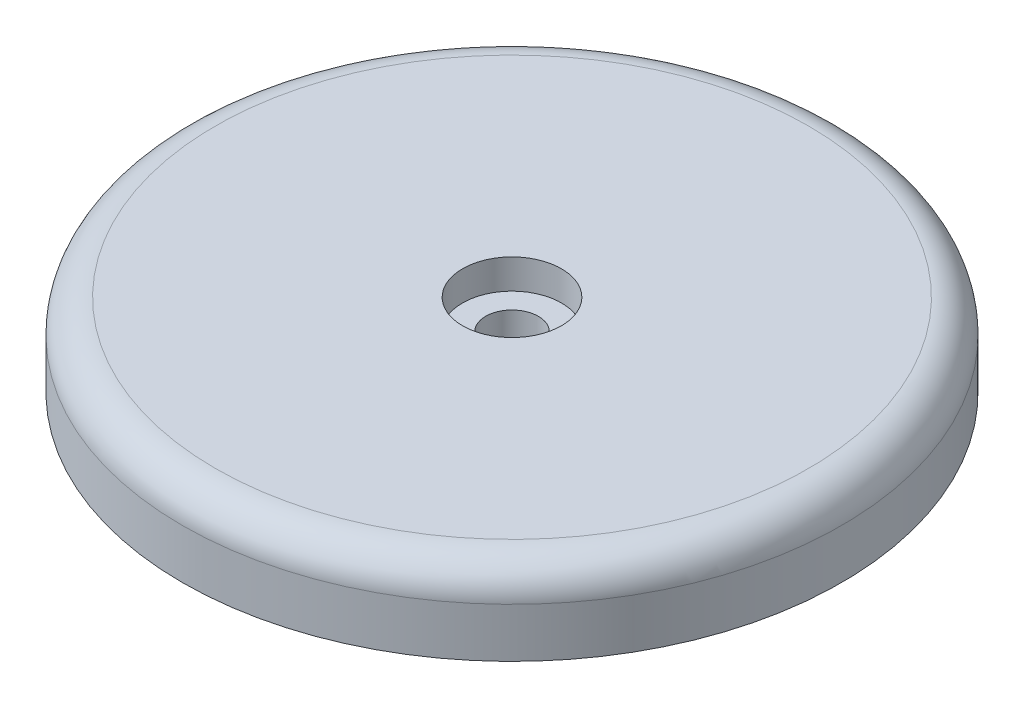
ISO-10303-21;
HEADER;
FILE_DESCRIPTION(('STEP AP214'),'2;1');
FILE_NAME('part.step','',(''),(''),'','','');
FILE_SCHEMA(('AUTOMOTIVE_DESIGN { 1 0 10303 214 1 1 1 1 }'));
ENDSEC;
DATA;
#1=APPLICATION_CONTEXT('core data for automotive mechanical design processes');
#2=APPLICATION_PROTOCOL_DEFINITION('international standard','automotive_design',2000,#1);
#3=PRODUCT_CONTEXT('',#1,'mechanical');
#4=PRODUCT('Part','Part','',(#3));
#5=PRODUCT_RELATED_PRODUCT_CATEGORY('part','',(#4));
#6=PRODUCT_DEFINITION_FORMATION('','',#4);
#7=PRODUCT_DEFINITION_CONTEXT('part definition',#1,'design');
#8=PRODUCT_DEFINITION('design','',#6,#7);
#9=PRODUCT_DEFINITION_SHAPE('','',#8);
#10=(LENGTH_UNIT() NAMED_UNIT(*) SI_UNIT(.MILLI.,.METRE.));
#11=(NAMED_UNIT(*) PLANE_ANGLE_UNIT() SI_UNIT($,.RADIAN.));
#12=(NAMED_UNIT(*) SI_UNIT($,.STERADIAN.) SOLID_ANGLE_UNIT());
#13=UNCERTAINTY_MEASURE_WITH_UNIT(LENGTH_MEASURE(1.E-05),#10,'distance_accuracy_value','');
#14=(GEOMETRIC_REPRESENTATION_CONTEXT(3) GLOBAL_UNCERTAINTY_ASSIGNED_CONTEXT((#13)) GLOBAL_UNIT_ASSIGNED_CONTEXT((#10,
#11,#12)) REPRESENTATION_CONTEXT('',''));
#15=CARTESIAN_POINT('',(0.,0.,0.));
#16=DIRECTION('',(0.,0.,1.));
#17=DIRECTION('',(1.,0.,0.));
#18=AXIS2_PLACEMENT_3D('',#15,#16,#17);
#19=CARTESIAN_POINT('',(0.,5.,0.));
#20=DIRECTION('',(0.,-1.,0.));
#21=DIRECTION('',(0.,0.,-1.));
#22=AXIS2_PLACEMENT_3D('',#19,#20,#21);
#23=CYLINDRICAL_SURFACE('',#22,20.);
#24=CARTESIAN_POINT('',(0.,3.,0.));
#25=DIRECTION('',(0.,1.,0.));
#26=DIRECTION('',(0.,0.,1.));
#27=AXIS2_PLACEMENT_3D('',#24,#25,#26);
#28=CIRCLE('',#27,20.);
#29=CARTESIAN_POINT('',(0.,3.,20.));
#30=VERTEX_POINT('',#29);
#31=EDGE_CURVE('E10',#30,#30,#28,.F.);
#32=ORIENTED_EDGE('',*,*,#31,.T.);
#33=EDGE_LOOP('',(#32));
#34=FACE_BOUND('',#33,.T.);
#35=CARTESIAN_POINT('',(0.,0.,0.));
#36=DIRECTION('',(0.,1.,0.));
#37=DIRECTION('',(0.,0.,1.));
#38=AXIS2_PLACEMENT_3D('',#35,#36,#37);
#39=CIRCLE('',#38,20.);
#40=CARTESIAN_POINT('',(0.,0.,20.));
#41=VERTEX_POINT('',#40);
#42=EDGE_CURVE('E56',#41,#41,#39,.T.);
#43=ORIENTED_EDGE('',*,*,#42,.T.);
#44=EDGE_LOOP('',(#43));
#45=FACE_BOUND('',#44,.T.);
#46=ADVANCED_FACE('F43',(#34,#45),#23,.T.);
#47=CARTESIAN_POINT('',(0.,5.,0.));
#48=DIRECTION('',(0.,1.,0.));
#49=DIRECTION('',(0.,0.,1.));
#50=AXIS2_PLACEMENT_3D('',#47,#48,#49);
#51=PLANE('',#50);
#52=CARTESIAN_POINT('',(0.,5.,0.));
#53=DIRECTION('',(0.,1.,0.));
#54=DIRECTION('',(0.,0.,1.));
#55=AXIS2_PLACEMENT_3D('',#52,#53,#54);
#56=CIRCLE('',#55,3.);
#57=CARTESIAN_POINT('',(0.,5.,3.));
#58=VERTEX_POINT('',#57);
#59=EDGE_CURVE('E64',#58,#58,#56,.T.);
#60=ORIENTED_EDGE('',*,*,#59,.F.);
#61=EDGE_LOOP('',(#60));
#62=FACE_BOUND('',#61,.T.);
#63=CARTESIAN_POINT('',(0.,5.,0.));
#64=DIRECTION('',(0.,1.,0.));
#65=DIRECTION('',(0.,0.,1.));
#66=AXIS2_PLACEMENT_3D('',#63,#64,#65);
#67=CIRCLE('',#66,18.);
#68=CARTESIAN_POINT('',(0.,5.,18.));
#69=VERTEX_POINT('',#68);
#70=EDGE_CURVE('E51',#69,#69,#67,.T.);
#71=ORIENTED_EDGE('',*,*,#70,.T.);
#72=EDGE_LOOP('',(#71));
#73=FACE_BOUND('',#72,.T.);
#74=ADVANCED_FACE('F101',(#62,#73),#51,.T.);
#75=CARTESIAN_POINT('',(0.,0.,0.));
#76=DIRECTION('',(0.,1.,0.));
#77=DIRECTION('',(0.,0.,1.));
#78=AXIS2_PLACEMENT_3D('',#75,#76,#77);
#79=PLANE('',#78);
#80=CARTESIAN_POINT('',(0.,0.,0.));
#81=DIRECTION('',(0.,1.,0.));
#82=DIRECTION('',(0.,0.,1.));
#83=AXIS2_PLACEMENT_3D('',#80,#81,#82);
#84=CIRCLE('',#83,1.6);
#85=CARTESIAN_POINT('',(0.,0.,1.6));
#86=VERTEX_POINT('',#85);
#87=EDGE_CURVE('E68',#86,#86,#84,.T.);
#88=ORIENTED_EDGE('',*,*,#87,.T.);
#89=EDGE_LOOP('',(#88));
#90=FACE_BOUND('',#89,.T.);
#91=ORIENTED_EDGE('',*,*,#42,.F.);
#92=EDGE_LOOP('',(#91));
#93=FACE_BOUND('',#92,.T.);
#94=ADVANCED_FACE('F80',(#90,#93),#79,.F.);
#95=CARTESIAN_POINT('',(0.,3.,0.));
#96=DIRECTION('',(0.,1.,0.));
#97=DIRECTION('',(0.,0.,1.));
#98=AXIS2_PLACEMENT_3D('',#95,#96,#97);
#99=TOROIDAL_SURFACE('',#98,18.,2.);
#100=ORIENTED_EDGE('',*,*,#31,.F.);
#101=EDGE_LOOP('',(#100));
#102=FACE_BOUND('',#101,.T.);
#103=ORIENTED_EDGE('',*,*,#70,.F.);
#104=EDGE_LOOP('',(#103));
#105=FACE_BOUND('',#104,.T.);
#106=ADVANCED_FACE('F45',(#102,#105),#99,.T.);
#107=CARTESIAN_POINT('',(0.,3.2,0.));
#108=DIRECTION('',(0.,1.,0.));
#109=DIRECTION('',(0.,0.,1.));
#110=AXIS2_PLACEMENT_3D('',#107,#108,#109);
#111=CYLINDRICAL_SURFACE('',#110,3.);
#112=CARTESIAN_POINT('',(0.,3.2,0.));
#113=DIRECTION('',(0.,1.,0.));
#114=DIRECTION('',(0.,0.,1.));
#115=AXIS2_PLACEMENT_3D('',#112,#113,#114);
#116=CIRCLE('',#115,3.);
#117=CARTESIAN_POINT('',(0.,3.2,3.));
#118=VERTEX_POINT('',#117);
#119=EDGE_CURVE('E61',#118,#118,#116,.T.);
#120=ORIENTED_EDGE('',*,*,#119,.F.);
#121=EDGE_LOOP('',(#120));
#122=FACE_BOUND('',#121,.T.);
#123=ORIENTED_EDGE('',*,*,#59,.T.);
#124=EDGE_LOOP('',(#123));
#125=FACE_BOUND('',#124,.T.);
#126=ADVANCED_FACE('F92',(#122,#125),#111,.F.);
#127=CARTESIAN_POINT('',(0.,3.2,0.));
#128=DIRECTION('',(0.,1.,0.));
#129=DIRECTION('',(0.,0.,1.));
#130=AXIS2_PLACEMENT_3D('',#127,#128,#129);
#131=PLANE('',#130);
#132=CARTESIAN_POINT('',(0.,3.2,0.));
#133=DIRECTION('',(0.,1.,0.));
#134=DIRECTION('',(0.,0.,1.));
#135=AXIS2_PLACEMENT_3D('',#132,#133,#134);
#136=CIRCLE('',#135,1.6);
#137=CARTESIAN_POINT('',(0.,3.2,1.6));
#138=VERTEX_POINT('',#137);
#139=EDGE_CURVE('E72',#138,#138,#136,.T.);
#140=ORIENTED_EDGE('',*,*,#139,.F.);
#141=EDGE_LOOP('',(#140));
#142=FACE_BOUND('',#141,.T.);
#143=ORIENTED_EDGE('',*,*,#119,.T.);
#144=EDGE_LOOP('',(#143));
#145=FACE_BOUND('',#144,.T.);
#146=ADVANCED_FACE('F86',(#142,#145),#131,.T.);
#147=CARTESIAN_POINT('',(0.,0.,0.));
#148=DIRECTION('',(0.,1.,0.));
#149=DIRECTION('',(0.,0.,1.));
#150=AXIS2_PLACEMENT_3D('',#147,#148,#149);
#151=CYLINDRICAL_SURFACE('',#150,1.6);
#152=ORIENTED_EDGE('',*,*,#87,.F.);
#153=EDGE_LOOP('',(#152));
#154=FACE_BOUND('',#153,.T.);
#155=ORIENTED_EDGE('',*,*,#139,.T.);
#156=EDGE_LOOP('',(#155));
#157=FACE_BOUND('',#156,.T.);
#158=ADVANCED_FACE('F83',(#154,#157),#151,.F.);
#159=CLOSED_SHELL('',(#46,#74,#94,#106,#126,#146,#158));
#160=MANIFOLD_SOLID_BREP('B2',#159);
#161=ADVANCED_BREP_SHAPE_REPRESENTATION('',(#18,#160),#14);
#162=SHAPE_DEFINITION_REPRESENTATION(#9,#161);
ENDSEC;
END-ISO-10303-21;
